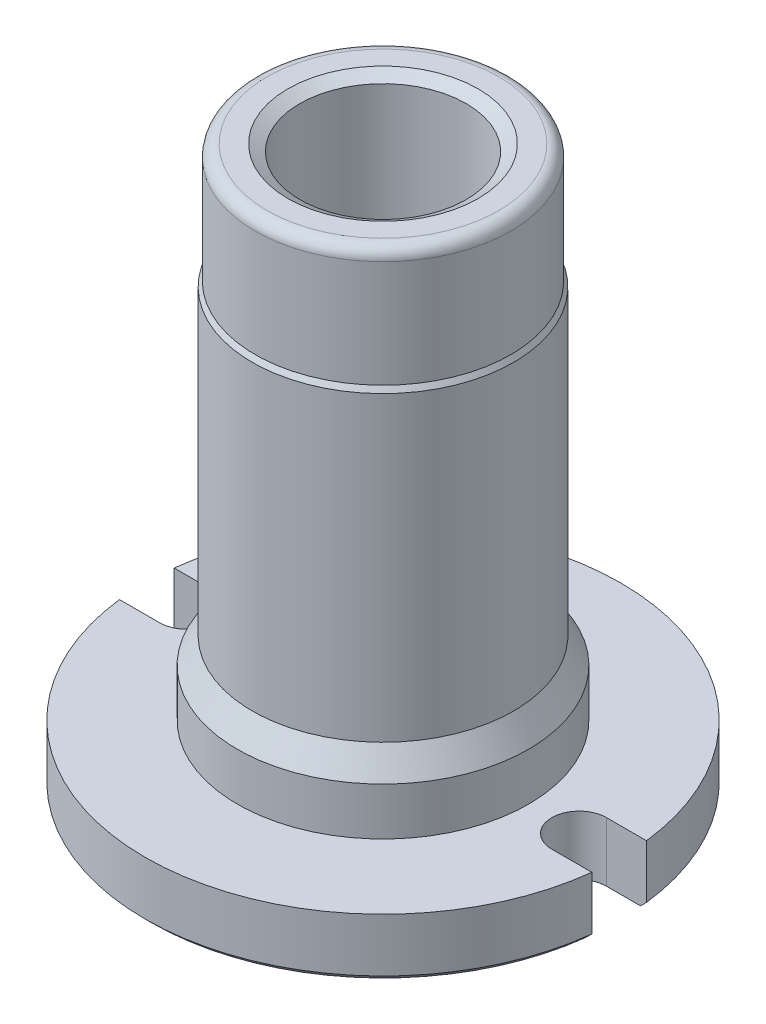
ISO-10303-21;
HEADER;
FILE_DESCRIPTION(('STEP AP214'),'2;1');
FILE_NAME('part.step','',(''),(''),'','','');
FILE_SCHEMA(('AUTOMOTIVE_DESIGN { 1 0 10303 214 1 1 1 1 }'));
ENDSEC;
DATA;
#1=APPLICATION_CONTEXT('core data for automotive mechanical design processes');
#2=APPLICATION_PROTOCOL_DEFINITION('international standard','automotive_design',2000,#1);
#3=PRODUCT_CONTEXT('',#1,'mechanical');
#4=PRODUCT('Part','Part','',(#3));
#5=PRODUCT_RELATED_PRODUCT_CATEGORY('part','',(#4));
#6=PRODUCT_DEFINITION_FORMATION('','',#4);
#7=PRODUCT_DEFINITION_CONTEXT('part definition',#1,'design');
#8=PRODUCT_DEFINITION('design','',#6,#7);
#9=PRODUCT_DEFINITION_SHAPE('','',#8);
#10=(LENGTH_UNIT() NAMED_UNIT(*) SI_UNIT(.MILLI.,.METRE.));
#11=(NAMED_UNIT(*) PLANE_ANGLE_UNIT() SI_UNIT($,.RADIAN.));
#12=(NAMED_UNIT(*) SI_UNIT($,.STERADIAN.) SOLID_ANGLE_UNIT());
#13=UNCERTAINTY_MEASURE_WITH_UNIT(LENGTH_MEASURE(1.E-05),#10,'distance_accuracy_value','');
#14=(GEOMETRIC_REPRESENTATION_CONTEXT(3) GLOBAL_UNCERTAINTY_ASSIGNED_CONTEXT((#13)) GLOBAL_UNIT_ASSIGNED_CONTEXT((#10,
#11,#12)) REPRESENTATION_CONTEXT('',''));
#15=CARTESIAN_POINT('',(0.,0.,0.));
#16=DIRECTION('',(0.,0.,1.));
#17=DIRECTION('',(1.,0.,0.));
#18=AXIS2_PLACEMENT_3D('',#15,#16,#17);
#19=CARTESIAN_POINT('',(0.,46.,0.));
#20=DIRECTION('',(0.,-1.,0.));
#21=DIRECTION('',(0.,0.,-1.));
#22=AXIS2_PLACEMENT_3D('',#19,#20,#21);
#23=TOROIDAL_SURFACE('',#22,9.75,1.);
#24=CARTESIAN_POINT('',(0.,46.,0.));
#25=DIRECTION('',(0.,-1.,0.));
#26=DIRECTION('',(0.,0.,-1.));
#27=AXIS2_PLACEMENT_3D('',#24,#25,#26);
#28=CIRCLE('',#27,10.75);
#29=CARTESIAN_POINT('',(0.,46.,-10.75));
#30=VERTEX_POINT('',#29);
#31=EDGE_CURVE('E214',#30,#30,#28,.T.);
#32=ORIENTED_EDGE('',*,*,#31,.F.);
#33=EDGE_LOOP('',(#32));
#34=FACE_BOUND('',#33,.T.);
#35=CARTESIAN_POINT('',(0.,47.,0.));
#36=DIRECTION('',(0.,1.,0.));
#37=DIRECTION('',(0.,0.,-1.));
#38=AXIS2_PLACEMENT_3D('',#35,#36,#37);
#39=CIRCLE('',#38,9.75);
#40=CARTESIAN_POINT('',(0.,47.,-9.75));
#41=VERTEX_POINT('',#40);
#42=EDGE_CURVE('E211',#41,#41,#39,.T.);
#43=ORIENTED_EDGE('',*,*,#42,.F.);
#44=EDGE_LOOP('',(#43));
#45=FACE_BOUND('',#44,.T.);
#46=ADVANCED_FACE('F16',(#34,#45),#23,.T.);
#47=CARTESIAN_POINT('',(0.,0.,0.));
#48=DIRECTION('',(0.,1.,0.));
#49=DIRECTION('',(0.,0.,1.));
#50=AXIS2_PLACEMENT_3D('',#47,#48,#49);
#51=CONICAL_SURFACE('',#50,19.5,0.785398162500002);
#52=CARTESIAN_POINT('',(19.8673098329895,0.5,2.3));
#53=CARTESIAN_POINT('',(19.6995155139597,0.333318913780959,2.3));
#54=CARTESIAN_POINT('',(19.531707240775,0.166651873546126,2.3));
#55=CARTESIAN_POINT('',(19.3638839079354,0.,2.3));
#56=(BOUNDED_CURVE() B_SPLINE_CURVE(3,(#52,#53,#54,#55),.UNSPECIFIED.,.F.,
.F.) B_SPLINE_CURVE_WITH_KNOTS((4,4),(0.,1.),
.UNSPECIFIED.) CURVE() GEOMETRIC_REPRESENTATION_ITEM() RATIONAL_B_SPLINE_CURVE((1.,1.,1.,1.)) REPRESENTATION_ITEM(''));
#57=CARTESIAN_POINT('',(19.8673098329895,0.5,2.3));
#58=VERTEX_POINT('',#57);
#59=CARTESIAN_POINT('',(19.3638839079354,0.,2.3));
#60=VERTEX_POINT('',#59);
#61=EDGE_CURVE('E173',#58,#60,#56,.T.);
#62=ORIENTED_EDGE('',*,*,#61,.F.);
#63=CARTESIAN_POINT('',(0.,0.5,0.));
#64=DIRECTION('',(0.,1.,0.));
#65=DIRECTION('',(0.,0.,1.));
#66=AXIS2_PLACEMENT_3D('',#63,#64,#65);
#67=CIRCLE('',#66,20.);
#68=CARTESIAN_POINT('',(-19.8673098329895,0.5,2.3));
#69=VERTEX_POINT('',#68);
#70=EDGE_CURVE('E177',#69,#58,#67,.T.);
#71=ORIENTED_EDGE('',*,*,#70,.F.);
#72=CARTESIAN_POINT('',(-19.3638839079354,0.,2.3));
#73=CARTESIAN_POINT('',(-19.531707240775,0.166651873546126,2.3));
#74=CARTESIAN_POINT('',(-19.6995155139597,0.333318913780963,2.3));
#75=CARTESIAN_POINT('',(-19.8673098329895,0.5,2.3));
#76=(BOUNDED_CURVE() B_SPLINE_CURVE(3,(#72,#73,#74,#75),.UNSPECIFIED.,.F.,
.F.) B_SPLINE_CURVE_WITH_KNOTS((4,4),(0.,1.),
.UNSPECIFIED.) CURVE() GEOMETRIC_REPRESENTATION_ITEM() RATIONAL_B_SPLINE_CURVE((1.,1.,1.,1.)) REPRESENTATION_ITEM(''));
#77=CARTESIAN_POINT('',(-19.3638839079354,0.,2.3));
#78=VERTEX_POINT('',#77);
#79=EDGE_CURVE('E47',#78,#69,#76,.T.);
#80=ORIENTED_EDGE('',*,*,#79,.F.);
#81=CARTESIAN_POINT('',(0.,0.,0.));
#82=DIRECTION('',(0.,-1.,0.));
#83=DIRECTION('',(0.,0.,1.));
#84=AXIS2_PLACEMENT_3D('',#81,#82,#83);
#85=CIRCLE('',#84,19.5);
#86=EDGE_CURVE('E180',#60,#78,#85,.T.);
#87=ORIENTED_EDGE('',*,*,#86,.F.);
#88=EDGE_LOOP('',(#62,#71,#80,#87));
#89=FACE_BOUND('',#88,.T.);
#90=ADVANCED_FACE('F175',(#89),#51,.T.);
#91=CARTESIAN_POINT('',(0.,0.,0.));
#92=DIRECTION('',(0.,1.,0.));
#93=DIRECTION('',(0.,0.,1.));
#94=AXIS2_PLACEMENT_3D('',#91,#92,#93);
#95=CONICAL_SURFACE('',#94,19.5,0.785398162500002);
#96=CARTESIAN_POINT('',(-19.8673098329895,0.5,-2.3));
#97=CARTESIAN_POINT('',(-19.6995155139597,0.333318913780963,-2.3));
#98=CARTESIAN_POINT('',(-19.531707240775,0.166651873546127,-2.3));
#99=CARTESIAN_POINT('',(-19.3638839079354,0.,-2.3));
#100=(BOUNDED_CURVE() B_SPLINE_CURVE(3,(#96,#97,#98,#99),.UNSPECIFIED.,.F.,
.F.) B_SPLINE_CURVE_WITH_KNOTS((4,4),(0.,1.),
.UNSPECIFIED.) CURVE() GEOMETRIC_REPRESENTATION_ITEM() RATIONAL_B_SPLINE_CURVE((1.,1.,1.,1.)) REPRESENTATION_ITEM(''));
#101=CARTESIAN_POINT('',(-19.8673098329895,0.5,-2.3));
#102=VERTEX_POINT('',#101);
#103=CARTESIAN_POINT('',(-19.3638839079354,0.,-2.3));
#104=VERTEX_POINT('',#103);
#105=EDGE_CURVE('E262',#102,#104,#100,.T.);
#106=ORIENTED_EDGE('',*,*,#105,.F.);
#107=CARTESIAN_POINT('',(0.,0.5,0.));
#108=DIRECTION('',(0.,1.,0.));
#109=DIRECTION('',(0.,0.,1.));
#110=AXIS2_PLACEMENT_3D('',#107,#108,#109);
#111=CIRCLE('',#110,20.);
#112=CARTESIAN_POINT('',(19.8673098329895,0.5,-2.3));
#113=VERTEX_POINT('',#112);
#114=EDGE_CURVE('E235',#113,#102,#111,.T.);
#115=ORIENTED_EDGE('',*,*,#114,.F.);
#116=CARTESIAN_POINT('',(19.3638839079354,0.,-2.3));
#117=CARTESIAN_POINT('',(19.531707240775,0.166651873546127,-2.3));
#118=CARTESIAN_POINT('',(19.6995155139597,0.333318913780962,-2.3));
#119=CARTESIAN_POINT('',(19.8673098329895,0.5,-2.3));
#120=(BOUNDED_CURVE() B_SPLINE_CURVE(3,(#116,#117,#118,#119),.UNSPECIFIED.,.F.,
.F.) B_SPLINE_CURVE_WITH_KNOTS((4,4),(0.,1.),
.UNSPECIFIED.) CURVE() GEOMETRIC_REPRESENTATION_ITEM() RATIONAL_B_SPLINE_CURVE((1.,1.,1.,1.)) REPRESENTATION_ITEM(''));
#121=CARTESIAN_POINT('',(19.3638839079354,0.,-2.3));
#122=VERTEX_POINT('',#121);
#123=EDGE_CURVE('E11',#122,#113,#120,.T.);
#124=ORIENTED_EDGE('',*,*,#123,.F.);
#125=CARTESIAN_POINT('',(0.,0.,0.));
#126=DIRECTION('',(0.,-1.,0.));
#127=DIRECTION('',(0.,0.,1.));
#128=AXIS2_PLACEMENT_3D('',#125,#126,#127);
#129=CIRCLE('',#128,19.5);
#130=EDGE_CURVE('E313',#104,#122,#129,.T.);
#131=ORIENTED_EDGE('',*,*,#130,.F.);
#132=EDGE_LOOP('',(#106,#115,#124,#131));
#133=FACE_BOUND('',#132,.T.);
#134=ADVANCED_FACE('F454',(#133),#95,.T.);
#135=CARTESIAN_POINT('',(16.5,51.7,-2.3));
#136=DIRECTION('',(0.,0.,-1.));
#137=DIRECTION('',(0.,-1.,0.));
#138=AXIS2_PLACEMENT_3D('',#135,#136,#137);
#139=PLANE('',#138);
#140=DIRECTION('',(1.,0.,0.));
#141=VECTOR('',#140,1.);
#142=CARTESIAN_POINT('',(16.5,0.,-2.3));
#143=LINE('',#142,#141);
#144=CARTESIAN_POINT('',(16.5000000000212,0.,-2.3));
#145=VERTEX_POINT('',#144);
#146=EDGE_CURVE('E317',#145,#122,#143,.T.);
#147=ORIENTED_EDGE('',*,*,#146,.T.);
#148=ORIENTED_EDGE('',*,*,#123,.T.);
#149=DIRECTION('',(0.,-1.,0.));
#150=VECTOR('',#149,1.);
#151=CARTESIAN_POINT('',(19.8673098329895,51.7,-2.3));
#152=LINE('',#151,#150);
#153=CARTESIAN_POINT('',(19.8673098329895,5.,-2.3));
#154=VERTEX_POINT('',#153);
#155=EDGE_CURVE('E281',#154,#113,#152,.T.);
#156=ORIENTED_EDGE('',*,*,#155,.F.);
#157=DIRECTION('',(1.,0.,0.));
#158=VECTOR('',#157,1.);
#159=CARTESIAN_POINT('',(0.,5.,-2.3));
#160=LINE('',#159,#158);
#161=CARTESIAN_POINT('',(16.5000000000212,5.,-2.3));
#162=VERTEX_POINT('',#161);
#163=EDGE_CURVE('E255',#162,#154,#160,.T.);
#164=ORIENTED_EDGE('',*,*,#163,.F.);
#165=DIRECTION('',(0.,-1.,0.));
#166=VECTOR('',#165,1.);
#167=CARTESIAN_POINT('',(16.5000000000212,51.7,-2.3));
#168=LINE('',#167,#166);
#169=EDGE_CURVE('E19',#162,#145,#168,.T.);
#170=ORIENTED_EDGE('',*,*,#169,.T.);
#171=EDGE_LOOP('',(#147,#148,#156,#164,#170));
#172=FACE_BOUND('',#171,.T.);
#173=ADVANCED_FACE('F519',(#172),#139,.F.);
#174=CARTESIAN_POINT('',(16.5,51.7,0.));
#175=DIRECTION('',(0.,-1.,0.));
#176=DIRECTION('',(0.,0.,-1.));
#177=AXIS2_PLACEMENT_3D('',#174,#175,#176);
#178=CYLINDRICAL_SURFACE('',#177,2.3);
#179=DIRECTION('',(0.,-1.,0.));
#180=VECTOR('',#179,1.);
#181=CARTESIAN_POINT('',(16.5,51.7,2.3));
#182=LINE('',#181,#180);
#183=CARTESIAN_POINT('',(16.5,5.,2.3));
#184=VERTEX_POINT('',#183);
#185=CARTESIAN_POINT('',(16.5,0.,2.3));
#186=VERTEX_POINT('',#185);
#187=EDGE_CURVE('E185',#184,#186,#182,.T.);
#188=ORIENTED_EDGE('',*,*,#187,.T.);
#189=CARTESIAN_POINT('',(16.5,0.,0.));
#190=DIRECTION('',(0.,-1.,0.));
#191=DIRECTION('',(1.,0.,0.));
#192=AXIS2_PLACEMENT_3D('',#189,#190,#191);
#193=CIRCLE('',#192,2.3);
#194=EDGE_CURVE('E321',#186,#145,#193,.T.);
#195=ORIENTED_EDGE('',*,*,#194,.T.);
#196=ORIENTED_EDGE('',*,*,#169,.F.);
#197=CARTESIAN_POINT('',(16.5,5.,0.));
#198=DIRECTION('',(0.,-1.,0.));
#199=DIRECTION('',(0.,0.,-1.));
#200=AXIS2_PLACEMENT_3D('',#197,#198,#199);
#201=CIRCLE('',#200,2.3);
#202=EDGE_CURVE('E249',#184,#162,#201,.T.);
#203=ORIENTED_EDGE('',*,*,#202,.F.);
#204=EDGE_LOOP('',(#188,#195,#196,#203));
#205=FACE_BOUND('',#204,.T.);
#206=ADVANCED_FACE('F512',(#205),#178,.F.);
#207=CARTESIAN_POINT('',(19.8673098329895,51.7,2.3));
#208=DIRECTION('',(0.,0.,1.));
#209=DIRECTION('',(1.,0.,0.));
#210=AXIS2_PLACEMENT_3D('',#207,#208,#209);
#211=PLANE('',#210);
#212=DIRECTION('',(0.,-1.,0.));
#213=VECTOR('',#212,1.);
#214=CARTESIAN_POINT('',(19.8673098329895,51.7,2.3));
#215=LINE('',#214,#213);
#216=CARTESIAN_POINT('',(19.8673098329895,5.,2.3));
#217=VERTEX_POINT('',#216);
#218=EDGE_CURVE('E187',#217,#58,#215,.T.);
#219=ORIENTED_EDGE('',*,*,#218,.T.);
#220=ORIENTED_EDGE('',*,*,#61,.T.);
#221=DIRECTION('',(-1.,0.,0.));
#222=VECTOR('',#221,1.);
#223=CARTESIAN_POINT('',(19.8673098329895,0.,2.3));
#224=LINE('',#223,#222);
#225=EDGE_CURVE('E325',#60,#186,#224,.T.);
#226=ORIENTED_EDGE('',*,*,#225,.T.);
#227=ORIENTED_EDGE('',*,*,#187,.F.);
#228=DIRECTION('',(-1.,0.,0.));
#229=VECTOR('',#228,1.);
#230=CARTESIAN_POINT('',(0.,5.,2.3));
#231=LINE('',#230,#229);
#232=EDGE_CURVE('E190',#217,#184,#231,.T.);
#233=ORIENTED_EDGE('',*,*,#232,.F.);
#234=EDGE_LOOP('',(#219,#220,#226,#227,#233));
#235=FACE_BOUND('',#234,.T.);
#236=ADVANCED_FACE('F188',(#235),#211,.F.);
#237=CARTESIAN_POINT('',(-16.5,51.7,2.3));
#238=DIRECTION('',(0.,0.,1.));
#239=DIRECTION('',(1.,0.,0.));
#240=AXIS2_PLACEMENT_3D('',#237,#238,#239);
#241=PLANE('',#240);
#242=DIRECTION('',(-1.,0.,0.));
#243=VECTOR('',#242,1.);
#244=CARTESIAN_POINT('',(-16.5,0.,2.3));
#245=LINE('',#244,#243);
#246=CARTESIAN_POINT('',(-16.4999999999788,0.,2.3));
#247=VERTEX_POINT('',#246);
#248=EDGE_CURVE('E330',#247,#78,#245,.T.);
#249=ORIENTED_EDGE('',*,*,#248,.T.);
#250=ORIENTED_EDGE('',*,*,#79,.T.);
#251=DIRECTION('',(0.,-1.,0.));
#252=VECTOR('',#251,1.);
#253=CARTESIAN_POINT('',(-19.8673098329895,51.7,2.3));
#254=LINE('',#253,#252);
#255=CARTESIAN_POINT('',(-19.8673098329895,5.,2.3));
#256=VERTEX_POINT('',#255);
#257=EDGE_CURVE('E199',#256,#69,#254,.T.);
#258=ORIENTED_EDGE('',*,*,#257,.F.);
#259=DIRECTION('',(-1.,0.,0.));
#260=VECTOR('',#259,1.);
#261=CARTESIAN_POINT('',(0.,5.,2.3));
#262=LINE('',#261,#260);
#263=CARTESIAN_POINT('',(-16.4999999999788,5.,2.3));
#264=VERTEX_POINT('',#263);
#265=EDGE_CURVE('E307',#264,#256,#262,.T.);
#266=ORIENTED_EDGE('',*,*,#265,.F.);
#267=DIRECTION('',(0.,-1.,0.));
#268=VECTOR('',#267,1.);
#269=CARTESIAN_POINT('',(-16.4999999999788,51.7,2.3));
#270=LINE('',#269,#268);
#271=EDGE_CURVE('E37',#264,#247,#270,.T.);
#272=ORIENTED_EDGE('',*,*,#271,.T.);
#273=EDGE_LOOP('',(#249,#250,#258,#266,#272));
#274=FACE_BOUND('',#273,.T.);
#275=ADVANCED_FACE('F498',(#274),#241,.F.);
#276=CARTESIAN_POINT('',(-16.5,51.7,0.));
#277=DIRECTION('',(0.,-1.,0.));
#278=DIRECTION('',(0.,0.,-1.));
#279=AXIS2_PLACEMENT_3D('',#276,#277,#278);
#280=CYLINDRICAL_SURFACE('',#279,2.3);
#281=DIRECTION('',(0.,-1.,0.));
#282=VECTOR('',#281,1.);
#283=CARTESIAN_POINT('',(-16.5,51.7,-2.3));
#284=LINE('',#283,#282);
#285=CARTESIAN_POINT('',(-16.5,5.,-2.3));
#286=VERTEX_POINT('',#285);
#287=CARTESIAN_POINT('',(-16.5,0.,-2.3));
#288=VERTEX_POINT('',#287);
#289=EDGE_CURVE('E267',#286,#288,#284,.T.);
#290=ORIENTED_EDGE('',*,*,#289,.T.);
#291=CARTESIAN_POINT('',(-16.5,0.,0.));
#292=DIRECTION('',(0.,-1.,0.));
#293=DIRECTION('',(1.,0.,0.));
#294=AXIS2_PLACEMENT_3D('',#291,#292,#293);
#295=CIRCLE('',#294,2.3);
#296=EDGE_CURVE('E268',#288,#247,#295,.T.);
#297=ORIENTED_EDGE('',*,*,#296,.T.);
#298=ORIENTED_EDGE('',*,*,#271,.F.);
#299=CARTESIAN_POINT('',(-16.5,5.,0.));
#300=DIRECTION('',(0.,-1.,0.));
#301=DIRECTION('',(0.,0.,-1.));
#302=AXIS2_PLACEMENT_3D('',#299,#300,#301);
#303=CIRCLE('',#302,2.3);
#304=EDGE_CURVE('E303',#286,#264,#303,.T.);
#305=ORIENTED_EDGE('',*,*,#304,.F.);
#306=EDGE_LOOP('',(#290,#297,#298,#305));
#307=FACE_BOUND('',#306,.T.);
#308=ADVANCED_FACE('F490',(#307),#280,.F.);
#309=CARTESIAN_POINT('',(-19.8673098329895,51.7,-2.3));
#310=DIRECTION('',(0.,0.,-1.));
#311=DIRECTION('',(0.,-1.,0.));
#312=AXIS2_PLACEMENT_3D('',#309,#310,#311);
#313=PLANE('',#312);
#314=DIRECTION('',(0.,-1.,0.));
#315=VECTOR('',#314,1.);
#316=CARTESIAN_POINT('',(-19.8673098329895,51.7,-2.3));
#317=LINE('',#316,#315);
#318=CARTESIAN_POINT('',(-19.8673098329895,5.,-2.3));
#319=VERTEX_POINT('',#318);
#320=EDGE_CURVE('E230',#319,#102,#317,.T.);
#321=ORIENTED_EDGE('',*,*,#320,.T.);
#322=ORIENTED_EDGE('',*,*,#105,.T.);
#323=DIRECTION('',(1.,0.,0.));
#324=VECTOR('',#323,1.);
#325=CARTESIAN_POINT('',(-19.8673098329895,0.,-2.3));
#326=LINE('',#325,#324);
#327=EDGE_CURVE('E234',#104,#288,#326,.T.);
#328=ORIENTED_EDGE('',*,*,#327,.T.);
#329=ORIENTED_EDGE('',*,*,#289,.F.);
#330=DIRECTION('',(1.,0.,0.));
#331=VECTOR('',#330,1.);
#332=CARTESIAN_POINT('',(0.,5.,-2.3));
#333=LINE('',#332,#331);
#334=EDGE_CURVE('E299',#319,#286,#333,.T.);
#335=ORIENTED_EDGE('',*,*,#334,.F.);
#336=EDGE_LOOP('',(#321,#322,#328,#329,#335));
#337=FACE_BOUND('',#336,.T.);
#338=ADVANCED_FACE('F482',(#337),#313,.F.);
#339=CARTESIAN_POINT('',(0.,0.,20.));
#340=DIRECTION('',(0.,1.,0.));
#341=DIRECTION('',(1.,0.,0.));
#342=AXIS2_PLACEMENT_3D('',#339,#340,#341);
#343=PLANE('',#342);
#344=ORIENTED_EDGE('',*,*,#327,.F.);
#345=ORIENTED_EDGE('',*,*,#130,.T.);
#346=ORIENTED_EDGE('',*,*,#146,.F.);
#347=ORIENTED_EDGE('',*,*,#194,.F.);
#348=ORIENTED_EDGE('',*,*,#225,.F.);
#349=ORIENTED_EDGE('',*,*,#86,.T.);
#350=ORIENTED_EDGE('',*,*,#248,.F.);
#351=ORIENTED_EDGE('',*,*,#296,.F.);
#352=EDGE_LOOP('',(#344,#345,#346,#347,#348,#349,#350,#351));
#353=FACE_BOUND('',#352,.T.);
#354=CARTESIAN_POINT('',(0.,0.,0.));
#355=DIRECTION('',(0.,-1.,0.));
#356=DIRECTION('',(0.,0.,-1.));
#357=AXIS2_PLACEMENT_3D('',#354,#355,#356);
#358=CIRCLE('',#357,9.65470053837925);
#359=CARTESIAN_POINT('',(0.,0.,-9.65470053837925));
#360=VERTEX_POINT('',#359);
#361=EDGE_CURVE('E221',#360,#360,#358,.T.);
#362=ORIENTED_EDGE('',*,*,#361,.F.);
#363=EDGE_LOOP('',(#362));
#364=FACE_BOUND('',#363,.T.);
#365=ADVANCED_FACE('F357',(#353,#364),#343,.F.);
#366=CARTESIAN_POINT('',(0.,0.,0.));
#367=DIRECTION('',(0.,-1.,0.));
#368=DIRECTION('',(0.,0.,-1.));
#369=AXIS2_PLACEMENT_3D('',#366,#367,#368);
#370=CYLINDRICAL_SURFACE('',#369,20.);
#371=ORIENTED_EDGE('',*,*,#155,.T.);
#372=ORIENTED_EDGE('',*,*,#114,.T.);
#373=ORIENTED_EDGE('',*,*,#320,.F.);
#374=CARTESIAN_POINT('',(0.,5.,0.));
#375=DIRECTION('',(0.,-1.,0.));
#376=DIRECTION('',(0.,0.,-1.));
#377=AXIS2_PLACEMENT_3D('',#374,#375,#376);
#378=CIRCLE('',#377,20.);
#379=EDGE_CURVE('E259',#319,#154,#378,.T.);
#380=ORIENTED_EDGE('',*,*,#379,.T.);
#381=EDGE_LOOP('',(#371,#372,#373,#380));
#382=FACE_BOUND('',#381,.T.);
#383=ADVANCED_FACE('F351',(#382),#370,.T.);
#384=CARTESIAN_POINT('',(0.,5.,12.25));
#385=DIRECTION('',(0.,-1.,0.));
#386=DIRECTION('',(0.,0.,-1.));
#387=AXIS2_PLACEMENT_3D('',#384,#385,#386);
#388=PLANE('',#387);
#389=CARTESIAN_POINT('',(0.,5.,0.));
#390=DIRECTION('',(0.,-1.,0.));
#391=DIRECTION('',(0.,0.,-1.));
#392=AXIS2_PLACEMENT_3D('',#389,#390,#391);
#393=CIRCLE('',#392,12.25);
#394=CARTESIAN_POINT('',(0.,5.,-12.25));
#395=VERTEX_POINT('',#394);
#396=EDGE_CURVE('E207',#395,#395,#393,.T.);
#397=ORIENTED_EDGE('',*,*,#396,.T.);
#398=EDGE_LOOP('',(#397));
#399=FACE_BOUND('',#398,.T.);
#400=CARTESIAN_POINT('',(0.,5.,0.));
#401=DIRECTION('',(0.,-1.,0.));
#402=DIRECTION('',(0.,0.,-1.));
#403=AXIS2_PLACEMENT_3D('',#400,#401,#402);
#404=CIRCLE('',#403,20.);
#405=EDGE_CURVE('E195',#217,#256,#404,.T.);
#406=ORIENTED_EDGE('',*,*,#405,.F.);
#407=ORIENTED_EDGE('',*,*,#232,.T.);
#408=ORIENTED_EDGE('',*,*,#202,.T.);
#409=ORIENTED_EDGE('',*,*,#163,.T.);
#410=ORIENTED_EDGE('',*,*,#379,.F.);
#411=ORIENTED_EDGE('',*,*,#334,.T.);
#412=ORIENTED_EDGE('',*,*,#304,.T.);
#413=ORIENTED_EDGE('',*,*,#265,.T.);
#414=EDGE_LOOP('',(#406,#407,#408,#409,#410,#411,#412,#413));
#415=FACE_BOUND('',#414,.T.);
#416=ADVANCED_FACE('F356',(#399,#415),#388,.F.);
#417=CARTESIAN_POINT('',(0.,0.,0.));
#418=DIRECTION('',(0.,-1.,0.));
#419=DIRECTION('',(0.,0.,-1.));
#420=AXIS2_PLACEMENT_3D('',#417,#418,#419);
#421=CYLINDRICAL_SURFACE('',#420,12.25);
#422=CARTESIAN_POINT('',(0.,9.,0.));
#423=DIRECTION('',(0.,-1.,0.));
#424=DIRECTION('',(0.,0.,-1.));
#425=AXIS2_PLACEMENT_3D('',#422,#423,#424);
#426=CIRCLE('',#425,12.25);
#427=CARTESIAN_POINT('',(0.,9.,-12.25));
#428=VERTEX_POINT('',#427);
#429=EDGE_CURVE('E210',#428,#428,#426,.T.);
#430=ORIENTED_EDGE('',*,*,#429,.T.);
#431=EDGE_LOOP('',(#430));
#432=FACE_BOUND('',#431,.T.);
#433=ORIENTED_EDGE('',*,*,#396,.F.);
#434=EDGE_LOOP('',(#433));
#435=FACE_BOUND('',#434,.T.);
#436=ADVANCED_FACE('F408',(#432,#435),#421,.T.);
#437=CARTESIAN_POINT('',(0.,11.1650635094611,0.));
#438=DIRECTION('',(0.,-1.,0.));
#439=DIRECTION('',(0.,0.,-1.));
#440=AXIS2_PLACEMENT_3D('',#437,#438,#439);
#441=CONICAL_SURFACE('',#440,11.,0.523598775);
#442=CARTESIAN_POINT('',(0.,11.1650635094611,0.));
#443=DIRECTION('',(0.,-1.,0.));
#444=DIRECTION('',(0.,0.,-1.));
#445=AXIS2_PLACEMENT_3D('',#442,#443,#444);
#446=CIRCLE('',#445,11.);
#447=CARTESIAN_POINT('',(0.,11.1650635094611,-11.));
#448=VERTEX_POINT('',#447);
#449=EDGE_CURVE('E253',#448,#448,#446,.T.);
#450=ORIENTED_EDGE('',*,*,#449,.T.);
#451=EDGE_LOOP('',(#450));
#452=FACE_BOUND('',#451,.T.);
#453=ORIENTED_EDGE('',*,*,#429,.F.);
#454=EDGE_LOOP('',(#453));
#455=FACE_BOUND('',#454,.T.);
#456=ADVANCED_FACE('F404',(#452,#455),#441,.T.);
#457=CARTESIAN_POINT('',(0.,0.,0.));
#458=DIRECTION('',(0.,-1.,0.));
#459=DIRECTION('',(0.,0.,-1.));
#460=AXIS2_PLACEMENT_3D('',#457,#458,#459);
#461=CYLINDRICAL_SURFACE('',#460,11.);
#462=CARTESIAN_POINT('',(0.,36.5669872981078,0.));
#463=DIRECTION('',(0.,-1.,0.));
#464=DIRECTION('',(0.,0.,-1.));
#465=AXIS2_PLACEMENT_3D('',#462,#463,#464);
#466=CIRCLE('',#465,11.);
#467=CARTESIAN_POINT('',(0.,36.5669872981078,-11.));
#468=VERTEX_POINT('',#467);
#469=EDGE_CURVE('E250',#468,#468,#466,.T.);
#470=ORIENTED_EDGE('',*,*,#469,.T.);
#471=EDGE_LOOP('',(#470));
#472=FACE_BOUND('',#471,.T.);
#473=ORIENTED_EDGE('',*,*,#449,.F.);
#474=EDGE_LOOP('',(#473));
#475=FACE_BOUND('',#474,.T.);
#476=ADVANCED_FACE('F375',(#472,#475),#461,.T.);
#477=CARTESIAN_POINT('',(0.,37.,0.));
#478=DIRECTION('',(0.,-1.,0.));
#479=DIRECTION('',(0.,0.,-1.));
#480=AXIS2_PLACEMENT_3D('',#477,#478,#479);
#481=CONICAL_SURFACE('',#480,10.75,0.523598774999994);
#482=CARTESIAN_POINT('',(0.,37.,0.));
#483=DIRECTION('',(0.,-1.,0.));
#484=DIRECTION('',(0.,0.,-1.));
#485=AXIS2_PLACEMENT_3D('',#482,#483,#484);
#486=CIRCLE('',#485,10.75);
#487=CARTESIAN_POINT('',(0.,37.,-10.75));
#488=VERTEX_POINT('',#487);
#489=EDGE_CURVE('E254',#488,#488,#486,.T.);
#490=ORIENTED_EDGE('',*,*,#489,.T.);
#491=EDGE_LOOP('',(#490));
#492=FACE_BOUND('',#491,.T.);
#493=ORIENTED_EDGE('',*,*,#469,.F.);
#494=EDGE_LOOP('',(#493));
#495=FACE_BOUND('',#494,.T.);
#496=ADVANCED_FACE('F370',(#492,#495),#481,.T.);
#497=CARTESIAN_POINT('',(0.,0.,0.));
#498=DIRECTION('',(0.,-1.,0.));
#499=DIRECTION('',(0.,0.,-1.));
#500=AXIS2_PLACEMENT_3D('',#497,#498,#499);
#501=CYLINDRICAL_SURFACE('',#500,10.75);
#502=ORIENTED_EDGE('',*,*,#489,.F.);
#503=EDGE_LOOP('',(#502));
#504=FACE_BOUND('',#503,.T.);
#505=ORIENTED_EDGE('',*,*,#31,.T.);
#506=EDGE_LOOP('',(#505));
#507=FACE_BOUND('',#506,.T.);
#508=ADVANCED_FACE('F374',(#504,#507),#501,.T.);
#509=CARTESIAN_POINT('',(0.,47.,8.));
#510=DIRECTION('',(0.,-1.,0.));
#511=DIRECTION('',(0.,0.,-1.));
#512=AXIS2_PLACEMENT_3D('',#509,#510,#511);
#513=PLANE('',#512);
#514=CARTESIAN_POINT('',(0.,47.,0.));
#515=DIRECTION('',(0.,-1.,0.));
#516=DIRECTION('',(0.,0.,-1.));
#517=AXIS2_PLACEMENT_3D('',#514,#515,#516);
#518=CIRCLE('',#517,8.);
#519=CARTESIAN_POINT('',(0.,47.,-8.));
#520=VERTEX_POINT('',#519);
#521=EDGE_CURVE('E215',#520,#520,#518,.T.);
#522=ORIENTED_EDGE('',*,*,#521,.T.);
#523=EDGE_LOOP('',(#522));
#524=FACE_BOUND('',#523,.T.);
#525=ORIENTED_EDGE('',*,*,#42,.T.);
#526=EDGE_LOOP('',(#525));
#527=FACE_BOUND('',#526,.T.);
#528=ADVANCED_FACE('F383',(#524,#527),#513,.F.);
#529=CARTESIAN_POINT('',(0.,46.4226497308104,0.));
#530=DIRECTION('',(0.,1.,0.));
#531=DIRECTION('',(0.,0.,1.));
#532=AXIS2_PLACEMENT_3D('',#529,#530,#531);
#533=CONICAL_SURFACE('',#532,7.,1.04719755);
#534=CARTESIAN_POINT('',(0.,46.4226497308104,0.));
#535=DIRECTION('',(0.,-1.,0.));
#536=DIRECTION('',(0.,0.,-1.));
#537=AXIS2_PLACEMENT_3D('',#534,#535,#536);
#538=CIRCLE('',#537,7.);
#539=CARTESIAN_POINT('',(0.,46.4226497308104,-7.));
#540=VERTEX_POINT('',#539);
#541=EDGE_CURVE('E229',#540,#540,#538,.T.);
#542=ORIENTED_EDGE('',*,*,#541,.T.);
#543=EDGE_LOOP('',(#542));
#544=FACE_BOUND('',#543,.T.);
#545=ORIENTED_EDGE('',*,*,#521,.F.);
#546=EDGE_LOOP('',(#545));
#547=FACE_BOUND('',#546,.T.);
#548=ADVANCED_FACE('F432',(#544,#547),#533,.F.);
#549=CARTESIAN_POINT('',(0.,0.,0.));
#550=DIRECTION('',(0.,-1.,0.));
#551=DIRECTION('',(0.,0.,-1.));
#552=AXIS2_PLACEMENT_3D('',#549,#550,#551);
#553=CYLINDRICAL_SURFACE('',#552,7.);
#554=CARTESIAN_POINT('',(0.,23.5773502691896,0.));
#555=DIRECTION('',(0.,-1.,0.));
#556=DIRECTION('',(0.,0.,-1.));
#557=AXIS2_PLACEMENT_3D('',#554,#555,#556);
#558=CIRCLE('',#557,7.);
#559=CARTESIAN_POINT('',(0.,23.5773502691896,-7.));
#560=VERTEX_POINT('',#559);
#561=EDGE_CURVE('E246',#560,#560,#558,.T.);
#562=ORIENTED_EDGE('',*,*,#561,.T.);
#563=EDGE_LOOP('',(#562));
#564=FACE_BOUND('',#563,.T.);
#565=ORIENTED_EDGE('',*,*,#541,.F.);
#566=EDGE_LOOP('',(#565));
#567=FACE_BOUND('',#566,.T.);
#568=ADVANCED_FACE('F424',(#564,#567),#553,.F.);
#569=CARTESIAN_POINT('',(0.,23.,0.));
#570=DIRECTION('',(0.,-1.,0.));
#571=DIRECTION('',(0.,0.,-1.));
#572=AXIS2_PLACEMENT_3D('',#569,#570,#571);
#573=CONICAL_SURFACE('',#572,8.,1.04719755);
#574=CARTESIAN_POINT('',(0.,23.,0.));
#575=DIRECTION('',(0.,-1.,0.));
#576=DIRECTION('',(0.,0.,-1.));
#577=AXIS2_PLACEMENT_3D('',#574,#575,#576);
#578=CIRCLE('',#577,8.);
#579=CARTESIAN_POINT('',(0.,23.,-8.));
#580=VERTEX_POINT('',#579);
#581=EDGE_CURVE('E237',#580,#580,#578,.T.);
#582=ORIENTED_EDGE('',*,*,#581,.T.);
#583=EDGE_LOOP('',(#582));
#584=FACE_BOUND('',#583,.T.);
#585=ORIENTED_EDGE('',*,*,#561,.F.);
#586=EDGE_LOOP('',(#585));
#587=FACE_BOUND('',#586,.T.);
#588=ADVANCED_FACE('F416',(#584,#587),#573,.F.);
#589=CARTESIAN_POINT('',(0.,23.,8.5));
#590=DIRECTION('',(0.,1.,0.));
#591=DIRECTION('',(1.,0.,0.));
#592=AXIS2_PLACEMENT_3D('',#589,#590,#591);
#593=PLANE('',#592);
#594=CARTESIAN_POINT('',(0.,23.,0.));
#595=DIRECTION('',(0.,-1.,0.));
#596=DIRECTION('',(0.,0.,-1.));
#597=AXIS2_PLACEMENT_3D('',#594,#595,#596);
#598=CIRCLE('',#597,8.5);
#599=CARTESIAN_POINT('',(0.,23.,-8.5));
#600=VERTEX_POINT('',#599);
#601=EDGE_CURVE('E226',#600,#600,#598,.T.);
#602=ORIENTED_EDGE('',*,*,#601,.T.);
#603=EDGE_LOOP('',(#602));
#604=FACE_BOUND('',#603,.T.);
#605=ORIENTED_EDGE('',*,*,#581,.F.);
#606=EDGE_LOOP('',(#605));
#607=FACE_BOUND('',#606,.T.);
#608=ADVANCED_FACE('F399',(#604,#607),#593,.F.);
#609=CARTESIAN_POINT('',(0.,0.,0.));
#610=DIRECTION('',(0.,-1.,0.));
#611=DIRECTION('',(0.,0.,-1.));
#612=AXIS2_PLACEMENT_3D('',#609,#610,#611);
#613=CYLINDRICAL_SURFACE('',#612,8.5);
#614=CARTESIAN_POINT('',(0.,2.,0.));
#615=DIRECTION('',(0.,-1.,0.));
#616=DIRECTION('',(0.,0.,-1.));
#617=AXIS2_PLACEMENT_3D('',#614,#615,#616);
#618=CIRCLE('',#617,8.5);
#619=CARTESIAN_POINT('',(0.,2.,-8.5));
#620=VERTEX_POINT('',#619);
#621=EDGE_CURVE('E218',#620,#620,#618,.T.);
#622=ORIENTED_EDGE('',*,*,#621,.T.);
#623=EDGE_LOOP('',(#622));
#624=FACE_BOUND('',#623,.T.);
#625=ORIENTED_EDGE('',*,*,#601,.F.);
#626=EDGE_LOOP('',(#625));
#627=FACE_BOUND('',#626,.T.);
#628=ADVANCED_FACE('F391',(#624,#627),#613,.F.);
#629=CARTESIAN_POINT('',(0.,0.,0.));
#630=DIRECTION('',(0.,-1.,0.));
#631=DIRECTION('',(0.,0.,-1.));
#632=AXIS2_PLACEMENT_3D('',#629,#630,#631);
#633=CONICAL_SURFACE('',#632,9.65470053837925,0.523598775);
#634=ORIENTED_EDGE('',*,*,#361,.T.);
#635=EDGE_LOOP('',(#634));
#636=FACE_BOUND('',#635,.T.);
#637=ORIENTED_EDGE('',*,*,#621,.F.);
#638=EDGE_LOOP('',(#637));
#639=FACE_BOUND('',#638,.T.);
#640=ADVANCED_FACE('F366',(#636,#639),#633,.F.);
#641=CARTESIAN_POINT('',(0.,0.,0.));
#642=DIRECTION('',(0.,-1.,0.));
#643=DIRECTION('',(0.,0.,-1.));
#644=AXIS2_PLACEMENT_3D('',#641,#642,#643);
#645=CYLINDRICAL_SURFACE('',#644,20.);
#646=ORIENTED_EDGE('',*,*,#257,.T.);
#647=ORIENTED_EDGE('',*,*,#70,.T.);
#648=ORIENTED_EDGE('',*,*,#218,.F.);
#649=ORIENTED_EDGE('',*,*,#405,.T.);
#650=EDGE_LOOP('',(#646,#647,#648,#649));
#651=FACE_BOUND('',#650,.T.);
#652=ADVANCED_FACE('F197',(#651),#645,.T.);
#653=CLOSED_SHELL('',(#46,#90,#134,#173,#206,#236,#275,#308,#338,#365,#383,#416,#436,#456,#476,
#496,#508,#528,#548,#568,#588,#608,#628,#640,#652));
#654=MANIFOLD_SOLID_BREP('B1',#653);
#655=ADVANCED_BREP_SHAPE_REPRESENTATION('',(#18,#654),#14);
#656=SHAPE_DEFINITION_REPRESENTATION(#9,#655);
ENDSEC;
END-ISO-10303-21;
